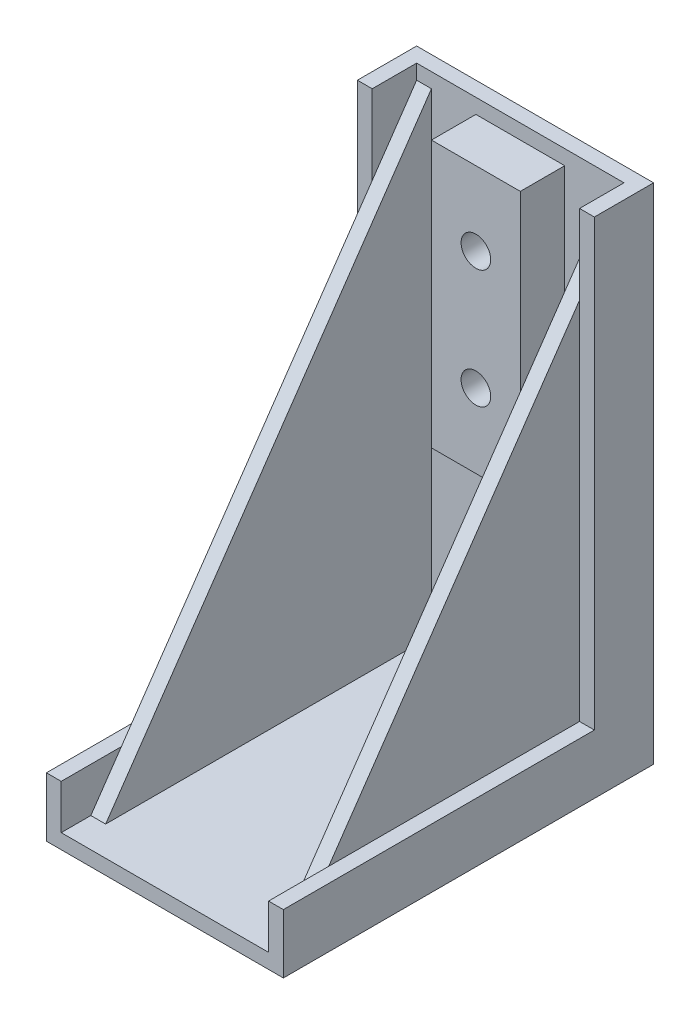
ISO-10303-21;
HEADER;
FILE_DESCRIPTION(('STEP AP214'),'2;1');
FILE_NAME('part.step','',(''),(''),'','','');
FILE_SCHEMA(('AUTOMOTIVE_DESIGN { 1 0 10303 214 1 1 1 1 }'));
ENDSEC;
DATA;
#1=APPLICATION_CONTEXT('core data for automotive mechanical design processes');
#2=APPLICATION_PROTOCOL_DEFINITION('international standard','automotive_design',2000,#1);
#3=PRODUCT_CONTEXT('',#1,'mechanical');
#4=PRODUCT('Part','Part','',(#3));
#5=PRODUCT_RELATED_PRODUCT_CATEGORY('part','',(#4));
#6=PRODUCT_DEFINITION_FORMATION('','',#4);
#7=PRODUCT_DEFINITION_CONTEXT('part definition',#1,'design');
#8=PRODUCT_DEFINITION('design','',#6,#7);
#9=PRODUCT_DEFINITION_SHAPE('','',#8);
#10=(LENGTH_UNIT() NAMED_UNIT(*) SI_UNIT(.MILLI.,.METRE.));
#11=(NAMED_UNIT(*) PLANE_ANGLE_UNIT() SI_UNIT($,.RADIAN.));
#12=(NAMED_UNIT(*) SI_UNIT($,.STERADIAN.) SOLID_ANGLE_UNIT());
#13=UNCERTAINTY_MEASURE_WITH_UNIT(LENGTH_MEASURE(1.E-05),#10,'distance_accuracy_value','');
#14=(GEOMETRIC_REPRESENTATION_CONTEXT(3) GLOBAL_UNCERTAINTY_ASSIGNED_CONTEXT((#13)) GLOBAL_UNIT_ASSIGNED_CONTEXT((#10,
#11,#12)) REPRESENTATION_CONTEXT('',''));
#15=CARTESIAN_POINT('',(0.,0.,0.));
#16=DIRECTION('',(0.,0.,1.));
#17=DIRECTION('',(1.,0.,0.));
#18=AXIS2_PLACEMENT_3D('',#15,#16,#17);
#19=CARTESIAN_POINT('',(1.25,22.5103021978022,60.9752747252747));
#20=DIRECTION('',(-1.,0.,0.));
#21=DIRECTION('',(0.,-1.,0.));
#22=AXIS2_PLACEMENT_3D('',#19,#20,#21);
#23=PLANE('',#22);
#24=DIRECTION('',(0.,0.,1.));
#25=VECTOR('',#24,1.);
#26=CARTESIAN_POINT('',(1.25,-13.7396978021978,33.4752747252747));
#27=LINE('',#26,#25);
#28=CARTESIAN_POINT('',(1.25,-13.7396978021978,37.2252747252747));
#29=VERTEX_POINT('',#28);
#30=CARTESIAN_POINT('',(1.25,-13.7396978021978,58.3971497252747));
#31=VERTEX_POINT('',#30);
#32=EDGE_CURVE('E271',#29,#31,#27,.T.);
#33=ORIENTED_EDGE('',*,*,#32,.T.);
#34=DIRECTION('',(0.,-0.824041924199368,0.566528822887065));
#35=VECTOR('',#34,1.);
#36=CARTESIAN_POINT('',(1.25,22.5103021978022,33.4752747252747));
#37=LINE('',#36,#35);
#38=CARTESIAN_POINT('',(1.25,17.0557567432567,37.2252747252747));
#39=VERTEX_POINT('',#38);
#40=EDGE_CURVE('E230',#39,#31,#37,.T.);
#41=ORIENTED_EDGE('',*,*,#40,.F.);
#42=DIRECTION('',(0.,-1.,0.));
#43=VECTOR('',#42,1.);
#44=CARTESIAN_POINT('',(1.25,23.7603021978022,37.2252747252747));
#45=LINE('',#44,#43);
#46=EDGE_CURVE('E277',#39,#29,#45,.T.);
#47=ORIENTED_EDGE('',*,*,#46,.T.);
#48=EDGE_LOOP('',(#33,#41,#47));
#49=FACE_BOUND('',#48,.T.);
#50=ADVANCED_FACE('F41',(#49),#23,.T.);
#51=CARTESIAN_POINT('',(2.5,22.5103021978022,60.9752747252747));
#52=DIRECTION('',(1.,0.,0.));
#53=DIRECTION('',(0.,1.,0.));
#54=AXIS2_PLACEMENT_3D('',#51,#52,#53);
#55=PLANE('',#54);
#56=DIRECTION('',(0.,-1.,0.));
#57=VECTOR('',#56,1.);
#58=CARTESIAN_POINT('',(2.5,22.5103021978022,33.4752747252747));
#59=LINE('',#58,#57);
#60=CARTESIAN_POINT('',(2.5,22.5103021978022,33.4752747252747));
#61=VERTEX_POINT('',#60);
#62=CARTESIAN_POINT('',(2.5,-17.4896978021978,33.4752747252747));
#63=VERTEX_POINT('',#62);
#64=EDGE_CURVE('E65',#61,#63,#59,.T.);
#65=ORIENTED_EDGE('',*,*,#64,.F.);
#66=DIRECTION('',(0.,-0.824041924199368,0.566528822887065));
#67=VECTOR('',#66,1.);
#68=CARTESIAN_POINT('',(2.5,22.5103021978022,33.4752747252747));
#69=LINE('',#68,#67);
#70=CARTESIAN_POINT('',(2.5,-17.4896978021978,60.9752747252747));
#71=VERTEX_POINT('',#70);
#72=EDGE_CURVE('E219',#61,#71,#69,.T.);
#73=ORIENTED_EDGE('',*,*,#72,.T.);
#74=DIRECTION('',(0.,0.,-1.));
#75=VECTOR('',#74,1.);
#76=CARTESIAN_POINT('',(2.5,-17.4896978021978,60.9752747252747));
#77=LINE('',#76,#75);
#78=EDGE_CURVE('E241',#71,#63,#77,.T.);
#79=ORIENTED_EDGE('',*,*,#78,.T.);
#80=EDGE_LOOP('',(#65,#73,#79));
#81=FACE_BOUND('',#80,.T.);
#82=ADVANCED_FACE('F431',(#81),#55,.T.);
#83=CARTESIAN_POINT('',(1.25,23.7603021978022,33.4752747252747));
#84=DIRECTION('',(-1.,0.,0.));
#85=DIRECTION('',(0.,-1.,0.));
#86=AXIS2_PLACEMENT_3D('',#83,#84,#85);
#87=PLANE('',#86);
#88=CARTESIAN_POINT('',(1.25,-13.7396978021978,63.4752747252747));
#89=VERTEX_POINT('',#88);
#90=EDGE_CURVE('E258',#31,#89,#27,.T.);
#91=ORIENTED_EDGE('',*,*,#90,.T.);
#92=DIRECTION('',(0.,1.,0.));
#93=VECTOR('',#92,1.);
#94=CARTESIAN_POINT('',(1.25,-17.4896978021978,63.4752747252747));
#95=LINE('',#94,#93);
#96=CARTESIAN_POINT('',(1.25,-17.4896978021978,63.4752747252747));
#97=VERTEX_POINT('',#96);
#98=EDGE_CURVE('E270',#97,#89,#95,.T.);
#99=ORIENTED_EDGE('',*,*,#98,.F.);
#100=DIRECTION('',(0.,0.,1.));
#101=VECTOR('',#100,1.);
#102=CARTESIAN_POINT('',(1.25,-17.4896978021978,33.4752747252747));
#103=LINE('',#102,#101);
#104=CARTESIAN_POINT('',(1.25,-17.4896978021978,60.9752747252747));
#105=VERTEX_POINT('',#104);
#106=EDGE_CURVE('E259',#105,#97,#103,.T.);
#107=ORIENTED_EDGE('',*,*,#106,.F.);
#108=EDGE_CURVE('E222',#31,#105,#37,.T.);
#109=ORIENTED_EDGE('',*,*,#108,.F.);
#110=EDGE_LOOP('',(#91,#99,#107,#109));
#111=FACE_BOUND('',#110,.T.);
#112=ADVANCED_FACE('F413',(#111),#87,.F.);
#113=CARTESIAN_POINT('',(18.75,23.7603021978022,33.4752747252747));
#114=DIRECTION('',(1.,0.,0.));
#115=DIRECTION('',(0.,1.,0.));
#116=AXIS2_PLACEMENT_3D('',#113,#114,#115);
#117=PLANE('',#116);
#118=DIRECTION('',(0.,1.,0.));
#119=VECTOR('',#118,1.);
#120=CARTESIAN_POINT('',(18.75,23.7603021978022,33.4752747252747));
#121=LINE('',#120,#119);
#122=CARTESIAN_POINT('',(18.75,22.5103021978022,33.4752747252747));
#123=VERTEX_POINT('',#122);
#124=CARTESIAN_POINT('',(18.75,23.7603021978022,33.4752747252747));
#125=VERTEX_POINT('',#124);
#126=EDGE_CURVE('E282',#123,#125,#121,.T.);
#127=ORIENTED_EDGE('',*,*,#126,.F.);
#128=DIRECTION('',(0.,-0.824041924199368,0.566528822887065));
#129=VECTOR('',#128,1.);
#130=CARTESIAN_POINT('',(18.75,22.5103021978022,33.4752747252747));
#131=LINE('',#130,#129);
#132=CARTESIAN_POINT('',(18.75,17.0557567432568,37.2252747252747));
#133=VERTEX_POINT('',#132);
#134=EDGE_CURVE('E232',#123,#133,#131,.T.);
#135=ORIENTED_EDGE('',*,*,#134,.T.);
#136=DIRECTION('',(0.,1.,0.));
#137=VECTOR('',#136,1.);
#138=CARTESIAN_POINT('',(18.75,23.7603021978022,37.2252747252747));
#139=LINE('',#138,#137);
#140=CARTESIAN_POINT('',(18.75,23.7603021978022,37.2252747252747));
#141=VERTEX_POINT('',#140);
#142=EDGE_CURVE('E291',#133,#141,#139,.T.);
#143=ORIENTED_EDGE('',*,*,#142,.T.);
#144=DIRECTION('',(0.,0.,1.));
#145=VECTOR('',#144,1.);
#146=CARTESIAN_POINT('',(18.75,23.7603021978022,33.4752747252747));
#147=LINE('',#146,#145);
#148=EDGE_CURVE('E288',#125,#141,#147,.T.);
#149=ORIENTED_EDGE('',*,*,#148,.F.);
#150=EDGE_LOOP('',(#127,#135,#143,#149));
#151=FACE_BOUND('',#150,.T.);
#152=ADVANCED_FACE('F398',(#151),#117,.F.);
#153=DIRECTION('',(0.,1.,0.));
#154=VECTOR('',#153,1.);
#155=CARTESIAN_POINT('',(18.75,-17.4896978021978,63.4752747252747));
#156=LINE('',#155,#154);
#157=CARTESIAN_POINT('',(18.75,-17.4896978021978,63.4752747252747));
#158=VERTEX_POINT('',#157);
#159=CARTESIAN_POINT('',(18.75,-13.7396978021978,63.4752747252747));
#160=VERTEX_POINT('',#159);
#161=EDGE_CURVE('E275',#158,#160,#156,.T.);
#162=ORIENTED_EDGE('',*,*,#161,.T.);
#163=DIRECTION('',(0.,0.,-1.));
#164=VECTOR('',#163,1.);
#165=CARTESIAN_POINT('',(18.75,-13.7396978021978,33.4752747252747));
#166=LINE('',#165,#164);
#167=CARTESIAN_POINT('',(18.75,-13.7396978021978,58.3971497252747));
#168=VERTEX_POINT('',#167);
#169=EDGE_CURVE('E262',#160,#168,#166,.T.);
#170=ORIENTED_EDGE('',*,*,#169,.T.);
#171=CARTESIAN_POINT('',(18.75,-17.4896978021978,60.9752747252747));
#172=VERTEX_POINT('',#171);
#173=EDGE_CURVE('E236',#168,#172,#131,.T.);
#174=ORIENTED_EDGE('',*,*,#173,.T.);
#175=DIRECTION('',(0.,0.,-1.));
#176=VECTOR('',#175,1.);
#177=CARTESIAN_POINT('',(18.75,-17.4896978021978,33.4752747252747));
#178=LINE('',#177,#176);
#179=EDGE_CURVE('E265',#158,#172,#178,.T.);
#180=ORIENTED_EDGE('',*,*,#179,.F.);
#181=EDGE_LOOP('',(#162,#170,#174,#180));
#182=FACE_BOUND('',#181,.T.);
#183=ADVANCED_FACE('F384',(#182),#117,.F.);
#184=CARTESIAN_POINT('',(0.,0.,33.4752747252747));
#185=DIRECTION('',(0.,0.,1.));
#186=DIRECTION('',(1.,0.,0.));
#187=AXIS2_PLACEMENT_3D('',#184,#185,#186);
#188=PLANE('',#187);
#189=DIRECTION('',(1.,0.,0.));
#190=VECTOR('',#189,1.);
#191=CARTESIAN_POINT('',(6.25,0.0103021978022019,33.4752747252747));
#192=LINE('',#191,#190);
#193=CARTESIAN_POINT('',(6.25,0.0103021978022019,33.4752747252747));
#194=VERTEX_POINT('',#193);
#195=CARTESIAN_POINT('',(13.75,0.0103021978022037,33.4752747252747));
#196=VERTEX_POINT('',#195);
#197=EDGE_CURVE('E654',#194,#196,#192,.T.);
#198=ORIENTED_EDGE('',*,*,#197,.F.);
#199=DIRECTION('',(0.,-1.,0.));
#200=VECTOR('',#199,1.);
#201=CARTESIAN_POINT('',(6.25,22.5103021978022,33.4752747252747));
#202=LINE('',#201,#200);
#203=CARTESIAN_POINT('',(6.25,22.5103021978022,33.4752747252747));
#204=VERTEX_POINT('',#203);
#205=EDGE_CURVE('E217',#204,#194,#202,.T.);
#206=ORIENTED_EDGE('',*,*,#205,.F.);
#207=DIRECTION('',(-1.,0.,0.));
#208=VECTOR('',#207,1.);
#209=CARTESIAN_POINT('',(6.25,22.5103021978022,33.4752747252747));
#210=LINE('',#209,#208);
#211=CARTESIAN_POINT('',(13.75,22.5103021978022,33.4752747252747));
#212=VERTEX_POINT('',#211);
#213=EDGE_CURVE('E213',#212,#204,#210,.T.);
#214=ORIENTED_EDGE('',*,*,#213,.F.);
#215=DIRECTION('',(0.,1.,0.));
#216=VECTOR('',#215,1.);
#217=CARTESIAN_POINT('',(13.75,22.5103021978022,33.4752747252747));
#218=LINE('',#217,#216);
#219=EDGE_CURVE('E656',#196,#212,#218,.T.);
#220=ORIENTED_EDGE('',*,*,#219,.F.);
#221=EDGE_LOOP('',(#198,#206,#214,#220));
#222=FACE_BOUND('',#221,.T.);
#223=ORIENTED_EDGE('',*,*,#64,.T.);
#224=DIRECTION('',(-1.,0.,0.));
#225=VECTOR('',#224,1.);
#226=CARTESIAN_POINT('',(1.25,-17.4896978021978,33.4752747252747));
#227=LINE('',#226,#225);
#228=CARTESIAN_POINT('',(17.5,-17.4896978021978,33.4752747252747));
#229=VERTEX_POINT('',#228);
#230=EDGE_CURVE('E268',#229,#63,#227,.T.);
#231=ORIENTED_EDGE('',*,*,#230,.F.);
#232=DIRECTION('',(0.,-1.,0.));
#233=VECTOR('',#232,1.);
#234=CARTESIAN_POINT('',(17.5,22.5103021978022,33.4752747252747));
#235=LINE('',#234,#233);
#236=CARTESIAN_POINT('',(17.5,22.5103021978022,33.4752747252747));
#237=VERTEX_POINT('',#236);
#238=EDGE_CURVE('E251',#237,#229,#235,.T.);
#239=ORIENTED_EDGE('',*,*,#238,.F.);
#240=DIRECTION('',(-1.,0.,0.));
#241=VECTOR('',#240,1.);
#242=CARTESIAN_POINT('',(18.75,22.5103021978022,33.4752747252747));
#243=LINE('',#242,#241);
#244=EDGE_CURVE('E247',#123,#237,#243,.T.);
#245=ORIENTED_EDGE('',*,*,#244,.F.);
#246=ORIENTED_EDGE('',*,*,#126,.T.);
#247=DIRECTION('',(-1.,0.,0.));
#248=VECTOR('',#247,1.);
#249=CARTESIAN_POINT('',(1.25,23.7603021978022,33.4752747252747));
#250=LINE('',#249,#248);
#251=CARTESIAN_POINT('',(1.25,23.7603021978022,33.4752747252747));
#252=VERTEX_POINT('',#251);
#253=EDGE_CURVE('E285',#125,#252,#250,.T.);
#254=ORIENTED_EDGE('',*,*,#253,.T.);
#255=DIRECTION('',(0.,-1.,0.));
#256=VECTOR('',#255,1.);
#257=CARTESIAN_POINT('',(1.25,23.7603021978022,33.4752747252747));
#258=LINE('',#257,#256);
#259=CARTESIAN_POINT('',(1.25,22.5103021978022,33.4752747252747));
#260=VERTEX_POINT('',#259);
#261=EDGE_CURVE('E279',#252,#260,#258,.T.);
#262=ORIENTED_EDGE('',*,*,#261,.T.);
#263=DIRECTION('',(1.,0.,0.));
#264=VECTOR('',#263,1.);
#265=CARTESIAN_POINT('',(1.25,22.5103021978022,33.4752747252747));
#266=LINE('',#265,#264);
#267=EDGE_CURVE('E242',#260,#61,#266,.T.);
#268=ORIENTED_EDGE('',*,*,#267,.T.);
#269=EDGE_LOOP('',(#223,#231,#239,#245,#246,#254,#262,#268));
#270=FACE_BOUND('',#269,.T.);
#271=ADVANCED_FACE('F403',(#222,#270),#188,.T.);
#272=CARTESIAN_POINT('',(0.,-17.4896978021978,0.));
#273=DIRECTION('',(0.,1.,0.));
#274=DIRECTION('',(0.,0.,1.));
#275=AXIS2_PLACEMENT_3D('',#272,#273,#274);
#276=PLANE('',#275);
#277=ORIENTED_EDGE('',*,*,#78,.F.);
#278=DIRECTION('',(-1.,0.,0.));
#279=VECTOR('',#278,1.);
#280=CARTESIAN_POINT('',(1.25,-17.4896978021978,60.9752747252747));
#281=LINE('',#280,#279);
#282=EDGE_CURVE('E238',#71,#105,#281,.T.);
#283=ORIENTED_EDGE('',*,*,#282,.T.);
#284=ORIENTED_EDGE('',*,*,#106,.T.);
#285=DIRECTION('',(1.,0.,0.));
#286=VECTOR('',#285,1.);
#287=CARTESIAN_POINT('',(1.25,-17.4896978021978,63.4752747252747));
#288=LINE('',#287,#286);
#289=EDGE_CURVE('E261',#97,#158,#288,.T.);
#290=ORIENTED_EDGE('',*,*,#289,.T.);
#291=ORIENTED_EDGE('',*,*,#179,.T.);
#292=DIRECTION('',(1.,0.,0.));
#293=VECTOR('',#292,1.);
#294=CARTESIAN_POINT('',(18.75,-17.4896978021978,60.9752747252747));
#295=LINE('',#294,#293);
#296=CARTESIAN_POINT('',(17.5,-17.4896978021978,60.9752747252747));
#297=VERTEX_POINT('',#296);
#298=EDGE_CURVE('E248',#297,#172,#295,.T.);
#299=ORIENTED_EDGE('',*,*,#298,.F.);
#300=DIRECTION('',(0.,0.,-1.));
#301=VECTOR('',#300,1.);
#302=CARTESIAN_POINT('',(17.5,-17.4896978021978,60.9752747252747));
#303=LINE('',#302,#301);
#304=EDGE_CURVE('E250',#297,#229,#303,.T.);
#305=ORIENTED_EDGE('',*,*,#304,.T.);
#306=ORIENTED_EDGE('',*,*,#230,.T.);
#307=EDGE_LOOP('',(#277,#283,#284,#290,#291,#299,#305,#306));
#308=FACE_BOUND('',#307,.T.);
#309=ADVANCED_FACE('F409',(#308),#276,.T.);
#310=CARTESIAN_POINT('',(20.,-13.7396978021978,37.2252747252747));
#311=DIRECTION('',(0.,-1.,0.));
#312=DIRECTION('',(0.,0.,-1.));
#313=AXIS2_PLACEMENT_3D('',#310,#311,#312);
#314=PLANE('',#313);
#315=DIRECTION('',(-1.,0.,0.));
#316=VECTOR('',#315,1.);
#317=CARTESIAN_POINT('',(20.,-13.7396978021978,63.4752747252747));
#318=LINE('',#317,#316);
#319=CARTESIAN_POINT('',(0.,-13.7396978021978,63.4752747252747));
#320=VERTEX_POINT('',#319);
#321=EDGE_CURVE('E338',#89,#320,#318,.T.);
#322=ORIENTED_EDGE('',*,*,#321,.F.);
#323=ORIENTED_EDGE('',*,*,#90,.F.);
#324=ORIENTED_EDGE('',*,*,#32,.F.);
#325=DIRECTION('',(-1.,0.,0.));
#326=VECTOR('',#325,1.);
#327=CARTESIAN_POINT('',(20.,-13.7396978021978,37.2252747252747));
#328=LINE('',#327,#326);
#329=CARTESIAN_POINT('',(0.,-13.7396978021978,37.2252747252747));
#330=VERTEX_POINT('',#329);
#331=EDGE_CURVE('E50',#29,#330,#328,.T.);
#332=ORIENTED_EDGE('',*,*,#331,.T.);
#333=DIRECTION('',(0.,0.,1.));
#334=VECTOR('',#333,1.);
#335=CARTESIAN_POINT('',(0.,-13.7396978021978,37.2252747252747));
#336=LINE('',#335,#334);
#337=EDGE_CURVE('E315',#330,#320,#336,.T.);
#338=ORIENTED_EDGE('',*,*,#337,.T.);
#339=EDGE_LOOP('',(#322,#323,#324,#332,#338));
#340=FACE_BOUND('',#339,.T.);
#341=ADVANCED_FACE('F354',(#340),#314,.F.);
#342=CARTESIAN_POINT('',(20.,23.7603021978022,37.2252747252747));
#343=DIRECTION('',(0.,0.,-1.));
#344=DIRECTION('',(0.,1.,0.));
#345=AXIS2_PLACEMENT_3D('',#342,#343,#344);
#346=PLANE('',#345);
#347=ORIENTED_EDGE('',*,*,#331,.F.);
#348=ORIENTED_EDGE('',*,*,#46,.F.);
#349=CARTESIAN_POINT('',(1.25,23.7603021978022,37.2252747252747));
#350=VERTEX_POINT('',#349);
#351=EDGE_CURVE('E289',#350,#39,#45,.T.);
#352=ORIENTED_EDGE('',*,*,#351,.F.);
#353=DIRECTION('',(-1.,0.,0.));
#354=VECTOR('',#353,1.);
#355=CARTESIAN_POINT('',(20.,23.7603021978022,37.2252747252747));
#356=LINE('',#355,#354);
#357=CARTESIAN_POINT('',(0.,23.7603021978022,37.2252747252747));
#358=VERTEX_POINT('',#357);
#359=EDGE_CURVE('E312',#350,#358,#356,.T.);
#360=ORIENTED_EDGE('',*,*,#359,.T.);
#361=DIRECTION('',(0.,-1.,0.));
#362=VECTOR('',#361,1.);
#363=CARTESIAN_POINT('',(0.,23.7603021978022,37.2252747252747));
#364=LINE('',#363,#362);
#365=EDGE_CURVE('E296',#358,#330,#364,.T.);
#366=ORIENTED_EDGE('',*,*,#365,.T.);
#367=EDGE_LOOP('',(#347,#348,#352,#360,#366));
#368=FACE_BOUND('',#367,.T.);
#369=ADVANCED_FACE('F419',(#368),#346,.F.);
#370=CARTESIAN_POINT('',(20.,23.7603021978022,37.2252747252747));
#371=VERTEX_POINT('',#370);
#372=EDGE_CURVE('E326',#371,#141,#356,.T.);
#373=ORIENTED_EDGE('',*,*,#372,.T.);
#374=ORIENTED_EDGE('',*,*,#142,.F.);
#375=CARTESIAN_POINT('',(18.75,-13.7396978021978,37.2252747252747));
#376=VERTEX_POINT('',#375);
#377=EDGE_CURVE('E283',#376,#133,#139,.T.);
#378=ORIENTED_EDGE('',*,*,#377,.F.);
#379=CARTESIAN_POINT('',(20.,-13.7396978021978,37.2252747252747));
#380=VERTEX_POINT('',#379);
#381=EDGE_CURVE('E11',#380,#376,#328,.T.);
#382=ORIENTED_EDGE('',*,*,#381,.F.);
#383=DIRECTION('',(0.,-1.,0.));
#384=VECTOR('',#383,1.);
#385=CARTESIAN_POINT('',(20.,23.7603021978022,37.2252747252747));
#386=LINE('',#385,#384);
#387=EDGE_CURVE('E298',#371,#380,#386,.T.);
#388=ORIENTED_EDGE('',*,*,#387,.F.);
#389=EDGE_LOOP('',(#373,#374,#378,#382,#388));
#390=FACE_BOUND('',#389,.T.);
#391=ADVANCED_FACE('F43',(#390),#346,.F.);
#392=ORIENTED_EDGE('',*,*,#381,.T.);
#393=DIRECTION('',(0.,0.,-1.));
#394=VECTOR('',#393,1.);
#395=CARTESIAN_POINT('',(18.75,-13.7396978021978,37.2252747252747));
#396=LINE('',#395,#394);
#397=EDGE_CURVE('E256',#168,#376,#396,.T.);
#398=ORIENTED_EDGE('',*,*,#397,.F.);
#399=ORIENTED_EDGE('',*,*,#169,.F.);
#400=CARTESIAN_POINT('',(20.,-13.7396978021978,63.4752747252747));
#401=VERTEX_POINT('',#400);
#402=EDGE_CURVE('E339',#401,#160,#318,.T.);
#403=ORIENTED_EDGE('',*,*,#402,.F.);
#404=DIRECTION('',(0.,0.,1.));
#405=VECTOR('',#404,1.);
#406=CARTESIAN_POINT('',(20.,-13.7396978021978,37.2252747252747));
#407=LINE('',#406,#405);
#408=EDGE_CURVE('E301',#380,#401,#407,.T.);
#409=ORIENTED_EDGE('',*,*,#408,.F.);
#410=EDGE_LOOP('',(#392,#398,#399,#403,#409));
#411=FACE_BOUND('',#410,.T.);
#412=ADVANCED_FACE('F379',(#411),#314,.F.);
#413=CARTESIAN_POINT('',(20.,-18.7396978021978,63.4752747252747));
#414=DIRECTION('',(0.,0.,-1.));
#415=DIRECTION('',(-1.,0.,0.));
#416=AXIS2_PLACEMENT_3D('',#413,#414,#415);
#417=PLANE('',#416);
#418=ORIENTED_EDGE('',*,*,#289,.F.);
#419=ORIENTED_EDGE('',*,*,#98,.T.);
#420=ORIENTED_EDGE('',*,*,#321,.T.);
#421=DIRECTION('',(0.,-1.,0.));
#422=VECTOR('',#421,1.);
#423=CARTESIAN_POINT('',(0.,-18.7396978021978,63.4752747252747));
#424=LINE('',#423,#422);
#425=CARTESIAN_POINT('',(0.,-18.7396978021978,63.4752747252747));
#426=VERTEX_POINT('',#425);
#427=EDGE_CURVE('E318',#320,#426,#424,.T.);
#428=ORIENTED_EDGE('',*,*,#427,.T.);
#429=DIRECTION('',(-1.,0.,0.));
#430=VECTOR('',#429,1.);
#431=CARTESIAN_POINT('',(20.,-18.7396978021978,63.4752747252747));
#432=LINE('',#431,#430);
#433=CARTESIAN_POINT('',(20.,-18.7396978021978,63.4752747252747));
#434=VERTEX_POINT('',#433);
#435=EDGE_CURVE('E335',#434,#426,#432,.T.);
#436=ORIENTED_EDGE('',*,*,#435,.F.);
#437=DIRECTION('',(0.,-1.,0.));
#438=VECTOR('',#437,1.);
#439=CARTESIAN_POINT('',(20.,-18.7396978021978,63.4752747252747));
#440=LINE('',#439,#438);
#441=EDGE_CURVE('E304',#401,#434,#440,.T.);
#442=ORIENTED_EDGE('',*,*,#441,.F.);
#443=ORIENTED_EDGE('',*,*,#402,.T.);
#444=ORIENTED_EDGE('',*,*,#161,.F.);
#445=EDGE_LOOP('',(#418,#419,#420,#428,#436,#442,#443,#444));
#446=FACE_BOUND('',#445,.T.);
#447=ADVANCED_FACE('F347',(#446),#417,.F.);
#448=CARTESIAN_POINT('',(20.,-18.7396978021978,32.2252747252747));
#449=DIRECTION('',(0.,1.,0.));
#450=DIRECTION('',(0.,0.,1.));
#451=AXIS2_PLACEMENT_3D('',#448,#449,#450);
#452=PLANE('',#451);
#453=DIRECTION('',(0.,0.,-1.));
#454=VECTOR('',#453,1.);
#455=CARTESIAN_POINT('',(0.,-18.7396978021978,32.2252747252747));
#456=LINE('',#455,#454);
#457=CARTESIAN_POINT('',(0.,-18.7396978021978,32.2252747252747));
#458=VERTEX_POINT('',#457);
#459=EDGE_CURVE('E320',#426,#458,#456,.T.);
#460=ORIENTED_EDGE('',*,*,#459,.T.);
#461=DIRECTION('',(-1.,0.,0.));
#462=VECTOR('',#461,1.);
#463=CARTESIAN_POINT('',(20.,-18.7396978021978,32.2252747252747));
#464=LINE('',#463,#462);
#465=CARTESIAN_POINT('',(20.,-18.7396978021978,32.2252747252747));
#466=VERTEX_POINT('',#465);
#467=EDGE_CURVE('E332',#466,#458,#464,.T.);
#468=ORIENTED_EDGE('',*,*,#467,.F.);
#469=DIRECTION('',(0.,0.,-1.));
#470=VECTOR('',#469,1.);
#471=CARTESIAN_POINT('',(20.,-18.7396978021978,32.2252747252747));
#472=LINE('',#471,#470);
#473=EDGE_CURVE('E306',#434,#466,#472,.T.);
#474=ORIENTED_EDGE('',*,*,#473,.F.);
#475=ORIENTED_EDGE('',*,*,#435,.T.);
#476=EDGE_LOOP('',(#460,#468,#474,#475));
#477=FACE_BOUND('',#476,.T.);
#478=ADVANCED_FACE('F365',(#477),#452,.F.);
#479=CARTESIAN_POINT('',(20.,23.7603021978022,32.2252747252747));
#480=DIRECTION('',(0.,0.,1.));
#481=DIRECTION('',(1.,0.,0.));
#482=AXIS2_PLACEMENT_3D('',#479,#480,#481);
#483=PLANE('',#482);
#484=CARTESIAN_POINT('',(10.,16.2603021978022,32.2252747252747));
#485=DIRECTION('',(0.,0.,1.));
#486=DIRECTION('',(1.,0.,0.));
#487=AXIS2_PLACEMENT_3D('',#484,#485,#486);
#488=CIRCLE('',#487,1.29853698558928);
#489=CARTESIAN_POINT('',(11.2985369855893,16.2603021978022,32.2252747252747));
#490=VERTEX_POINT('',#489);
#491=EDGE_CURVE('E634',#490,#490,#488,.T.);
#492=ORIENTED_EDGE('',*,*,#491,.T.);
#493=EDGE_LOOP('',(#492));
#494=FACE_BOUND('',#493,.T.);
#495=CARTESIAN_POINT('',(10.,6.2603021978022,32.2252747252747));
#496=DIRECTION('',(0.,0.,1.));
#497=DIRECTION('',(1.,0.,0.));
#498=AXIS2_PLACEMENT_3D('',#495,#496,#497);
#499=CIRCLE('',#498,1.25);
#500=CARTESIAN_POINT('',(11.25,6.2603021978022,32.2252747252747));
#501=VERTEX_POINT('',#500);
#502=EDGE_CURVE('E638',#501,#501,#499,.T.);
#503=ORIENTED_EDGE('',*,*,#502,.T.);
#504=EDGE_LOOP('',(#503));
#505=FACE_BOUND('',#504,.T.);
#506=DIRECTION('',(0.,1.,0.));
#507=VECTOR('',#506,1.);
#508=CARTESIAN_POINT('',(0.,23.7603021978022,32.2252747252747));
#509=LINE('',#508,#507);
#510=CARTESIAN_POINT('',(0.,23.7603021978022,32.2252747252747));
#511=VERTEX_POINT('',#510);
#512=EDGE_CURVE('E322',#458,#511,#509,.T.);
#513=ORIENTED_EDGE('',*,*,#512,.T.);
#514=DIRECTION('',(-1.,0.,0.));
#515=VECTOR('',#514,1.);
#516=CARTESIAN_POINT('',(20.,23.7603021978022,32.2252747252747));
#517=LINE('',#516,#515);
#518=CARTESIAN_POINT('',(20.,23.7603021978022,32.2252747252747));
#519=VERTEX_POINT('',#518);
#520=EDGE_CURVE('E329',#519,#511,#517,.T.);
#521=ORIENTED_EDGE('',*,*,#520,.F.);
#522=DIRECTION('',(0.,1.,0.));
#523=VECTOR('',#522,1.);
#524=CARTESIAN_POINT('',(20.,23.7603021978022,32.2252747252747));
#525=LINE('',#524,#523);
#526=EDGE_CURVE('E308',#466,#519,#525,.T.);
#527=ORIENTED_EDGE('',*,*,#526,.F.);
#528=ORIENTED_EDGE('',*,*,#467,.T.);
#529=EDGE_LOOP('',(#513,#521,#527,#528));
#530=FACE_BOUND('',#529,.T.);
#531=ADVANCED_FACE('F369',(#494,#505,#530),#483,.F.);
#532=CARTESIAN_POINT('',(20.,23.7603021978022,37.2252747252747));
#533=DIRECTION('',(0.,-1.,0.));
#534=DIRECTION('',(0.,0.,-1.));
#535=AXIS2_PLACEMENT_3D('',#532,#533,#534);
#536=PLANE('',#535);
#537=ORIENTED_EDGE('',*,*,#359,.F.);
#538=DIRECTION('',(0.,0.,1.));
#539=VECTOR('',#538,1.);
#540=CARTESIAN_POINT('',(1.25,23.7603021978022,33.4752747252747));
#541=LINE('',#540,#539);
#542=EDGE_CURVE('E294',#252,#350,#541,.T.);
#543=ORIENTED_EDGE('',*,*,#542,.F.);
#544=ORIENTED_EDGE('',*,*,#253,.F.);
#545=ORIENTED_EDGE('',*,*,#148,.T.);
#546=ORIENTED_EDGE('',*,*,#372,.F.);
#547=DIRECTION('',(0.,0.,1.));
#548=VECTOR('',#547,1.);
#549=CARTESIAN_POINT('',(20.,23.7603021978022,37.2252747252747));
#550=LINE('',#549,#548);
#551=EDGE_CURVE('E310',#519,#371,#550,.T.);
#552=ORIENTED_EDGE('',*,*,#551,.F.);
#553=ORIENTED_EDGE('',*,*,#520,.T.);
#554=DIRECTION('',(0.,0.,1.));
#555=VECTOR('',#554,1.);
#556=CARTESIAN_POINT('',(0.,23.7603021978022,37.2252747252747));
#557=LINE('',#556,#555);
#558=EDGE_CURVE('E302',#511,#358,#557,.T.);
#559=ORIENTED_EDGE('',*,*,#558,.T.);
#560=EDGE_LOOP('',(#537,#543,#544,#545,#546,#552,#553,#559));
#561=FACE_BOUND('',#560,.T.);
#562=ADVANCED_FACE('F423',(#561),#536,.F.);
#563=CARTESIAN_POINT('',(20.,0.,0.));
#564=DIRECTION('',(-1.,0.,0.));
#565=DIRECTION('',(0.,0.,1.));
#566=AXIS2_PLACEMENT_3D('',#563,#564,#565);
#567=PLANE('',#566);
#568=ORIENTED_EDGE('',*,*,#387,.T.);
#569=ORIENTED_EDGE('',*,*,#408,.T.);
#570=ORIENTED_EDGE('',*,*,#441,.T.);
#571=ORIENTED_EDGE('',*,*,#473,.T.);
#572=ORIENTED_EDGE('',*,*,#526,.T.);
#573=ORIENTED_EDGE('',*,*,#551,.T.);
#574=EDGE_LOOP('',(#568,#569,#570,#571,#572,#573));
#575=FACE_BOUND('',#574,.T.);
#576=ADVANCED_FACE('F373',(#575),#567,.F.);
#577=CARTESIAN_POINT('',(0.,0.,0.));
#578=DIRECTION('',(-1.,0.,0.));
#579=DIRECTION('',(0.,0.,1.));
#580=AXIS2_PLACEMENT_3D('',#577,#578,#579);
#581=PLANE('',#580);
#582=ORIENTED_EDGE('',*,*,#365,.F.);
#583=ORIENTED_EDGE('',*,*,#558,.F.);
#584=ORIENTED_EDGE('',*,*,#512,.F.);
#585=ORIENTED_EDGE('',*,*,#459,.F.);
#586=ORIENTED_EDGE('',*,*,#427,.F.);
#587=ORIENTED_EDGE('',*,*,#337,.F.);
#588=EDGE_LOOP('',(#582,#583,#584,#585,#586,#587));
#589=FACE_BOUND('',#588,.T.);
#590=ADVANCED_FACE('F360',(#589),#581,.T.);
#591=ORIENTED_EDGE('',*,*,#351,.T.);
#592=EDGE_CURVE('E227',#260,#39,#37,.T.);
#593=ORIENTED_EDGE('',*,*,#592,.F.);
#594=ORIENTED_EDGE('',*,*,#261,.F.);
#595=ORIENTED_EDGE('',*,*,#542,.T.);
#596=EDGE_LOOP('',(#591,#593,#594,#595));
#597=FACE_BOUND('',#596,.T.);
#598=ADVANCED_FACE('F427',(#597),#87,.F.);
#599=CARTESIAN_POINT('',(18.75,22.5103021978022,60.9752747252747));
#600=DIRECTION('',(-1.,0.,0.));
#601=DIRECTION('',(0.,-1.,0.));
#602=AXIS2_PLACEMENT_3D('',#599,#600,#601);
#603=PLANE('',#602);
#604=ORIENTED_EDGE('',*,*,#377,.T.);
#605=EDGE_CURVE('E235',#133,#168,#131,.T.);
#606=ORIENTED_EDGE('',*,*,#605,.T.);
#607=ORIENTED_EDGE('',*,*,#397,.T.);
#608=EDGE_LOOP('',(#604,#606,#607));
#609=FACE_BOUND('',#608,.T.);
#610=ADVANCED_FACE('F391',(#609),#603,.F.);
#611=CARTESIAN_POINT('',(17.5,22.5103021978022,60.9752747252747));
#612=DIRECTION('',(1.,0.,0.));
#613=DIRECTION('',(0.,1.,0.));
#614=AXIS2_PLACEMENT_3D('',#611,#612,#613);
#615=PLANE('',#614);
#616=ORIENTED_EDGE('',*,*,#304,.F.);
#617=DIRECTION('',(0.,-0.824041924199368,0.566528822887065));
#618=VECTOR('',#617,1.);
#619=CARTESIAN_POINT('',(17.5,22.5103021978022,33.4752747252747));
#620=LINE('',#619,#618);
#621=EDGE_CURVE('E229',#237,#297,#620,.T.);
#622=ORIENTED_EDGE('',*,*,#621,.F.);
#623=ORIENTED_EDGE('',*,*,#238,.T.);
#624=EDGE_LOOP('',(#616,#622,#623));
#625=FACE_BOUND('',#624,.T.);
#626=ADVANCED_FACE('F406',(#625),#615,.F.);
#627=CARTESIAN_POINT('',(18.75,22.5103021978022,33.4752747252747));
#628=DIRECTION('',(0.,-0.566528822887065,-0.824041924199368));
#629=DIRECTION('',(0.,0.824041924199368,-0.566528822887065));
#630=AXIS2_PLACEMENT_3D('',#627,#628,#629);
#631=PLANE('',#630);
#632=ORIENTED_EDGE('',*,*,#621,.T.);
#633=ORIENTED_EDGE('',*,*,#298,.T.);
#634=ORIENTED_EDGE('',*,*,#173,.F.);
#635=ORIENTED_EDGE('',*,*,#605,.F.);
#636=ORIENTED_EDGE('',*,*,#134,.F.);
#637=ORIENTED_EDGE('',*,*,#244,.T.);
#638=EDGE_LOOP('',(#632,#633,#634,#635,#636,#637));
#639=FACE_BOUND('',#638,.T.);
#640=ADVANCED_FACE('F388',(#639),#631,.F.);
#641=CARTESIAN_POINT('',(1.25,22.5103021978022,33.4752747252747));
#642=DIRECTION('',(0.,0.566528822887065,0.824041924199368));
#643=DIRECTION('',(0.,-0.824041924199368,0.566528822887065));
#644=AXIS2_PLACEMENT_3D('',#641,#642,#643);
#645=PLANE('',#644);
#646=ORIENTED_EDGE('',*,*,#72,.F.);
#647=ORIENTED_EDGE('',*,*,#267,.F.);
#648=ORIENTED_EDGE('',*,*,#592,.T.);
#649=ORIENTED_EDGE('',*,*,#40,.T.);
#650=ORIENTED_EDGE('',*,*,#108,.T.);
#651=ORIENTED_EDGE('',*,*,#282,.F.);
#652=EDGE_LOOP('',(#646,#647,#648,#649,#650,#651));
#653=FACE_BOUND('',#652,.T.);
#654=ADVANCED_FACE('F429',(#653),#645,.T.);
#655=CARTESIAN_POINT('',(0.,0.,37.2252747252747));
#656=DIRECTION('',(0.,0.,1.));
#657=DIRECTION('',(1.,0.,0.));
#658=AXIS2_PLACEMENT_3D('',#655,#656,#657);
#659=PLANE('',#658);
#660=CARTESIAN_POINT('',(10.,16.2603021978022,37.2252747252747));
#661=DIRECTION('',(0.,0.,1.));
#662=DIRECTION('',(1.,0.,0.));
#663=AXIS2_PLACEMENT_3D('',#660,#661,#662);
#664=CIRCLE('',#663,1.25);
#665=CARTESIAN_POINT('',(11.25,16.2603021978022,37.2252747252747));
#666=VERTEX_POINT('',#665);
#667=EDGE_CURVE('E647',#666,#666,#664,.T.);
#668=ORIENTED_EDGE('',*,*,#667,.F.);
#669=EDGE_LOOP('',(#668));
#670=FACE_BOUND('',#669,.T.);
#671=DIRECTION('',(0.,-1.,0.));
#672=VECTOR('',#671,1.);
#673=CARTESIAN_POINT('',(6.25,22.5103021978022,37.2252747252747));
#674=LINE('',#673,#672);
#675=CARTESIAN_POINT('',(6.25,22.5103021978022,37.2252747252747));
#676=VERTEX_POINT('',#675);
#677=CARTESIAN_POINT('',(6.25,0.0103021978022019,37.2252747252747));
#678=VERTEX_POINT('',#677);
#679=EDGE_CURVE('E204',#676,#678,#674,.T.);
#680=ORIENTED_EDGE('',*,*,#679,.T.);
#681=DIRECTION('',(1.,0.,0.));
#682=VECTOR('',#681,1.);
#683=CARTESIAN_POINT('',(6.25,0.0103021978022019,37.2252747252747));
#684=LINE('',#683,#682);
#685=CARTESIAN_POINT('',(13.75,0.0103021978022037,37.2252747252747));
#686=VERTEX_POINT('',#685);
#687=EDGE_CURVE('E193',#678,#686,#684,.T.);
#688=ORIENTED_EDGE('',*,*,#687,.T.);
#689=DIRECTION('',(0.,1.,0.));
#690=VECTOR('',#689,1.);
#691=CARTESIAN_POINT('',(13.75,22.5103021978022,37.2252747252747));
#692=LINE('',#691,#690);
#693=CARTESIAN_POINT('',(13.75,22.5103021978022,37.2252747252747));
#694=VERTEX_POINT('',#693);
#695=EDGE_CURVE('E203',#686,#694,#692,.T.);
#696=ORIENTED_EDGE('',*,*,#695,.T.);
#697=DIRECTION('',(-1.,0.,0.));
#698=VECTOR('',#697,1.);
#699=CARTESIAN_POINT('',(6.25,22.5103021978022,37.2252747252747));
#700=LINE('',#699,#698);
#701=EDGE_CURVE('E209',#694,#676,#700,.T.);
#702=ORIENTED_EDGE('',*,*,#701,.T.);
#703=EDGE_LOOP('',(#680,#688,#696,#702));
#704=FACE_BOUND('',#703,.T.);
#705=CARTESIAN_POINT('',(10.,6.2603021978022,37.2252747252747));
#706=DIRECTION('',(0.,0.,1.));
#707=DIRECTION('',(1.,0.,0.));
#708=AXIS2_PLACEMENT_3D('',#705,#706,#707);
#709=CIRCLE('',#708,1.25);
#710=CARTESIAN_POINT('',(11.25,6.2603021978022,37.2252747252747));
#711=VERTEX_POINT('',#710);
#712=EDGE_CURVE('E644',#711,#711,#709,.T.);
#713=ORIENTED_EDGE('',*,*,#712,.F.);
#714=EDGE_LOOP('',(#713));
#715=FACE_BOUND('',#714,.T.);
#716=ADVANCED_FACE('F207',(#670,#704,#715),#659,.T.);
#717=CARTESIAN_POINT('',(6.25,22.5103021978022,37.2252747252747));
#718=DIRECTION('',(1.,0.,0.));
#719=DIRECTION('',(0.,1.,0.));
#720=AXIS2_PLACEMENT_3D('',#717,#718,#719);
#721=PLANE('',#720);
#722=ORIENTED_EDGE('',*,*,#205,.T.);
#723=DIRECTION('',(0.,0.,-1.));
#724=VECTOR('',#723,1.);
#725=CARTESIAN_POINT('',(6.25,0.0103021978022019,37.2252747252747));
#726=LINE('',#725,#724);
#727=EDGE_CURVE('E197',#678,#194,#726,.T.);
#728=ORIENTED_EDGE('',*,*,#727,.F.);
#729=ORIENTED_EDGE('',*,*,#679,.F.);
#730=DIRECTION('',(0.,0.,-1.));
#731=VECTOR('',#730,1.);
#732=CARTESIAN_POINT('',(6.25,22.5103021978022,37.2252747252747));
#733=LINE('',#732,#731);
#734=EDGE_CURVE('E652',#676,#204,#733,.T.);
#735=ORIENTED_EDGE('',*,*,#734,.T.);
#736=EDGE_LOOP('',(#722,#728,#729,#735));
#737=FACE_BOUND('',#736,.T.);
#738=ADVANCED_FACE('F215',(#737),#721,.F.);
#739=CARTESIAN_POINT('',(6.25,0.0103021978022019,37.2252747252747));
#740=DIRECTION('',(0.,1.,0.));
#741=DIRECTION('',(-1.,0.,0.));
#742=AXIS2_PLACEMENT_3D('',#739,#740,#741);
#743=PLANE('',#742);
#744=ORIENTED_EDGE('',*,*,#197,.T.);
#745=DIRECTION('',(0.,0.,-1.));
#746=VECTOR('',#745,1.);
#747=CARTESIAN_POINT('',(13.75,0.0103021978022037,37.2252747252747));
#748=LINE('',#747,#746);
#749=EDGE_CURVE('E200',#686,#196,#748,.T.);
#750=ORIENTED_EDGE('',*,*,#749,.F.);
#751=ORIENTED_EDGE('',*,*,#687,.F.);
#752=ORIENTED_EDGE('',*,*,#727,.T.);
#753=EDGE_LOOP('',(#744,#750,#751,#752));
#754=FACE_BOUND('',#753,.T.);
#755=ADVANCED_FACE('F195',(#754),#743,.F.);
#756=CARTESIAN_POINT('',(13.75,22.5103021978022,37.2252747252747));
#757=DIRECTION('',(-1.,0.,0.));
#758=DIRECTION('',(0.,-1.,0.));
#759=AXIS2_PLACEMENT_3D('',#756,#757,#758);
#760=PLANE('',#759);
#761=ORIENTED_EDGE('',*,*,#219,.T.);
#762=DIRECTION('',(0.,0.,-1.));
#763=VECTOR('',#762,1.);
#764=CARTESIAN_POINT('',(13.75,22.5103021978022,37.2252747252747));
#765=LINE('',#764,#763);
#766=EDGE_CURVE('E57',#694,#212,#765,.T.);
#767=ORIENTED_EDGE('',*,*,#766,.F.);
#768=ORIENTED_EDGE('',*,*,#695,.F.);
#769=ORIENTED_EDGE('',*,*,#749,.T.);
#770=EDGE_LOOP('',(#761,#767,#768,#769));
#771=FACE_BOUND('',#770,.T.);
#772=ADVANCED_FACE('F572',(#771),#760,.F.);
#773=CARTESIAN_POINT('',(6.25,22.5103021978022,37.2252747252747));
#774=DIRECTION('',(0.,-1.,0.));
#775=DIRECTION('',(0.,0.,-1.));
#776=AXIS2_PLACEMENT_3D('',#773,#774,#775);
#777=PLANE('',#776);
#778=ORIENTED_EDGE('',*,*,#213,.T.);
#779=ORIENTED_EDGE('',*,*,#734,.F.);
#780=ORIENTED_EDGE('',*,*,#701,.F.);
#781=ORIENTED_EDGE('',*,*,#766,.T.);
#782=EDGE_LOOP('',(#778,#779,#780,#781));
#783=FACE_BOUND('',#782,.T.);
#784=ADVANCED_FACE('F580',(#783),#777,.F.);
#785=CARTESIAN_POINT('',(10.,16.2603021978022,37.2252747252747));
#786=DIRECTION('',(0.,0.,-1.));
#787=DIRECTION('',(-1.,0.,0.));
#788=AXIS2_PLACEMENT_3D('',#785,#786,#787);
#789=CYLINDRICAL_SURFACE('',#788,1.25);
#790=ORIENTED_EDGE('',*,*,#667,.T.);
#791=EDGE_LOOP('',(#790));
#792=FACE_BOUND('',#791,.T.);
#793=CARTESIAN_POINT('',(10.,16.2603021978022,33.4752747252747));
#794=DIRECTION('',(0.,0.,1.));
#795=DIRECTION('',(1.,0.,0.));
#796=AXIS2_PLACEMENT_3D('',#793,#794,#795);
#797=CIRCLE('',#796,1.25);
#798=CARTESIAN_POINT('',(11.25,16.2603021978022,33.4752747252747));
#799=VERTEX_POINT('',#798);
#800=EDGE_CURVE('E45',#799,#799,#797,.F.);
#801=ORIENTED_EDGE('',*,*,#800,.T.);
#802=EDGE_LOOP('',(#801));
#803=FACE_BOUND('',#802,.T.);
#804=ADVANCED_FACE('F589',(#792,#803),#789,.F.);
#805=CARTESIAN_POINT('',(10.,6.2603021978022,37.2252747252747));
#806=DIRECTION('',(0.,0.,-1.));
#807=DIRECTION('',(-1.,0.,0.));
#808=AXIS2_PLACEMENT_3D('',#805,#806,#807);
#809=CYLINDRICAL_SURFACE('',#808,1.25);
#810=ORIENTED_EDGE('',*,*,#712,.T.);
#811=EDGE_LOOP('',(#810));
#812=FACE_BOUND('',#811,.T.);
#813=ORIENTED_EDGE('',*,*,#502,.F.);
#814=EDGE_LOOP('',(#813));
#815=FACE_BOUND('',#814,.T.);
#816=ADVANCED_FACE('F596',(#812,#815),#809,.F.);
#817=CARTESIAN_POINT('',(10.,16.2603021978022,33.4752747252747));
#818=DIRECTION('',(0.,0.,1.));
#819=DIRECTION('',(1.,0.,0.));
#820=AXIS2_PLACEMENT_3D('',#817,#818,#819);
#821=PLANE('',#820);
#822=CARTESIAN_POINT('',(10.,16.2603021978022,33.4752747252747));
#823=DIRECTION('',(0.,0.,1.));
#824=DIRECTION('',(1.,0.,0.));
#825=AXIS2_PLACEMENT_3D('',#822,#823,#824);
#826=CIRCLE('',#825,1.29853698558928);
#827=CARTESIAN_POINT('',(11.2985369855893,16.2603021978022,33.4752747252747));
#828=VERTEX_POINT('',#827);
#829=EDGE_CURVE('E637',#828,#828,#826,.T.);
#830=ORIENTED_EDGE('',*,*,#829,.F.);
#831=EDGE_LOOP('',(#830));
#832=FACE_BOUND('',#831,.T.);
#833=ORIENTED_EDGE('',*,*,#800,.F.);
#834=EDGE_LOOP('',(#833));
#835=FACE_BOUND('',#834,.T.);
#836=ADVANCED_FACE('F604',(#832,#835),#821,.F.);
#837=CARTESIAN_POINT('',(10.,16.2603021978022,32.2252747252747));
#838=DIRECTION('',(0.,0.,1.));
#839=DIRECTION('',(1.,0.,0.));
#840=AXIS2_PLACEMENT_3D('',#837,#838,#839);
#841=CYLINDRICAL_SURFACE('',#840,1.29853698558928);
#842=ORIENTED_EDGE('',*,*,#491,.F.);
#843=EDGE_LOOP('',(#842));
#844=FACE_BOUND('',#843,.T.);
#845=ORIENTED_EDGE('',*,*,#829,.T.);
#846=EDGE_LOOP('',(#845));
#847=FACE_BOUND('',#846,.T.);
#848=ADVANCED_FACE('F614',(#844,#847),#841,.F.);
#849=CLOSED_SHELL('',(#50,#82,#112,#152,#183,#271,#309,#341,#369,#391,#412,#447,#478,#531,#562,
#576,#590,#598,#610,#626,#640,#654,#716,#738,#755,#772,#784,#804,#816,#836,#848));
#850=MANIFOLD_SOLID_BREP('B2',#849);
#851=ADVANCED_BREP_SHAPE_REPRESENTATION('',(#18,#850),#14);
#852=SHAPE_DEFINITION_REPRESENTATION(#9,#851);
ENDSEC;
END-ISO-10303-21;
